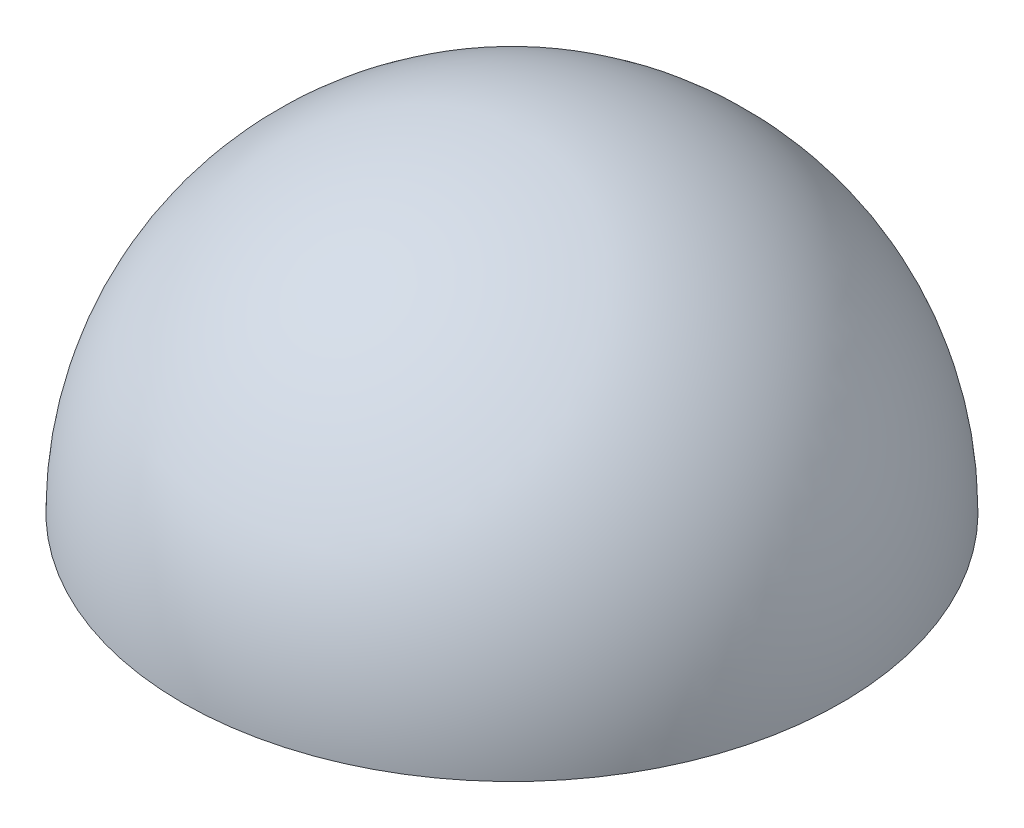
ISO-10303-21;
HEADER;
FILE_DESCRIPTION(('STEP AP214'),'2;1');
FILE_NAME('part.step','',(''),(''),'','','');
FILE_SCHEMA(('AUTOMOTIVE_DESIGN { 1 0 10303 214 1 1 1 1 }'));
ENDSEC;
DATA;
#1=APPLICATION_CONTEXT('core data for automotive mechanical design processes');
#2=APPLICATION_PROTOCOL_DEFINITION('international standard','automotive_design',2000,#1);
#3=PRODUCT_CONTEXT('',#1,'mechanical');
#4=PRODUCT('Part','Part','',(#3));
#5=PRODUCT_RELATED_PRODUCT_CATEGORY('part','',(#4));
#6=PRODUCT_DEFINITION_FORMATION('','',#4);
#7=PRODUCT_DEFINITION_CONTEXT('part definition',#1,'design');
#8=PRODUCT_DEFINITION('design','',#6,#7);
#9=PRODUCT_DEFINITION_SHAPE('','',#8);
#10=(LENGTH_UNIT() NAMED_UNIT(*) SI_UNIT(.MILLI.,.METRE.));
#11=(NAMED_UNIT(*) PLANE_ANGLE_UNIT() SI_UNIT($,.RADIAN.));
#12=(NAMED_UNIT(*) SI_UNIT($,.STERADIAN.) SOLID_ANGLE_UNIT());
#13=UNCERTAINTY_MEASURE_WITH_UNIT(LENGTH_MEASURE(1.E-05),#10,'distance_accuracy_value','');
#14=(GEOMETRIC_REPRESENTATION_CONTEXT(3) GLOBAL_UNCERTAINTY_ASSIGNED_CONTEXT((#13)) GLOBAL_UNIT_ASSIGNED_CONTEXT((#10,
#11,#12)) REPRESENTATION_CONTEXT('',''));
#15=CARTESIAN_POINT('',(0.,0.,0.));
#16=DIRECTION('',(0.,0.,1.));
#17=DIRECTION('',(1.,0.,0.));
#18=AXIS2_PLACEMENT_3D('',#15,#16,#17);
#19=CARTESIAN_POINT('',(3.2499999999994,76.7499999999998,0.249999999999985));
#20=DIRECTION('',(1.,0.,0.));
#21=DIRECTION('',(0.,0.,1.));
#22=AXIS2_PLACEMENT_3D('',#19,#20,#21);
#23=SPHERICAL_SURFACE('',#22,10.25);
#24=CARTESIAN_POINT('',(3.2499999999994,76.7499999999998,0.249999999999985));
#25=DIRECTION('',(0.,1.,0.));
#26=DIRECTION('',(0.,0.,1.));
#27=AXIS2_PLACEMENT_3D('',#24,#25,#26);
#28=SPHERICAL_SURFACE('',#27,10.25);
#29=CARTESIAN_POINT('',(3.2499999999994,76.7499999999998,0.249999999999985));
#30=DIRECTION('',(0.,1.,0.));
#31=DIRECTION('',(0.,0.,1.));
#32=AXIS2_PLACEMENT_3D('',#29,#30,#31);
#33=CIRCLE('',#32,10.25);
#34=CARTESIAN_POINT('',(3.2499999999994,76.7499999999999,10.5));
#35=VERTEX_POINT('',#34);
#36=EDGE_CURVE('E11',#35,#35,#33,.T.);
#37=ORIENTED_EDGE('',*,*,#36,.T.);
#38=EDGE_LOOP('',(#37));
#39=FACE_BOUND('',#38,.T.);
#40=ADVANCED_FACE('F35',(#39),#28,.T.);
#41=CARTESIAN_POINT('',(3.2499999999994,76.7499999999998,0.249999999999985));
#42=DIRECTION('',(0.,1.,0.));
#43=DIRECTION('',(0.,0.,1.));
#44=AXIS2_PLACEMENT_3D('',#41,#42,#43);
#45=PLANE('',#44);
#46=DIRECTION('',(-1.,0.,0.));
#47=VECTOR('',#46,1.);
#48=CARTESIAN_POINT('',(1.7499999999994,76.7499999999998,1.74999999999998));
#49=LINE('',#48,#47);
#50=CARTESIAN_POINT('',(4.7499999999994,76.7499999999998,1.74999999999998));
#51=VERTEX_POINT('',#50);
#52=CARTESIAN_POINT('',(1.7499999999994,76.7499999999998,1.74999999999998));
#53=VERTEX_POINT('',#52);
#54=EDGE_CURVE('E83',#51,#53,#49,.T.);
#55=ORIENTED_EDGE('',*,*,#54,.F.);
#56=DIRECTION('',(0.,0.,1.));
#57=VECTOR('',#56,1.);
#58=CARTESIAN_POINT('',(4.7499999999994,76.7499999999998,-1.25000000000002));
#59=LINE('',#58,#57);
#60=CARTESIAN_POINT('',(4.7499999999994,76.7499999999998,-1.25000000000002));
#61=VERTEX_POINT('',#60);
#62=EDGE_CURVE('E49',#61,#51,#59,.T.);
#63=ORIENTED_EDGE('',*,*,#62,.F.);
#64=DIRECTION('',(1.,0.,0.));
#65=VECTOR('',#64,1.);
#66=CARTESIAN_POINT('',(1.7499999999994,76.7499999999998,-1.25000000000002));
#67=LINE('',#66,#65);
#68=CARTESIAN_POINT('',(1.7499999999994,76.7499999999998,-1.25000000000002));
#69=VERTEX_POINT('',#68);
#70=EDGE_CURVE('E99',#69,#61,#67,.T.);
#71=ORIENTED_EDGE('',*,*,#70,.F.);
#72=DIRECTION('',(0.,0.,-1.));
#73=VECTOR('',#72,1.);
#74=CARTESIAN_POINT('',(1.7499999999994,76.7499999999998,-1.25000000000002));
#75=LINE('',#74,#73);
#76=EDGE_CURVE('E105',#53,#69,#75,.T.);
#77=ORIENTED_EDGE('',*,*,#76,.F.);
#78=EDGE_LOOP('',(#55,#63,#71,#77));
#79=FACE_BOUND('',#78,.T.);
#80=ORIENTED_EDGE('',*,*,#36,.F.);
#81=EDGE_LOOP('',(#80));
#82=FACE_BOUND('',#81,.T.);
#83=ADVANCED_FACE('F110',(#79,#82),#45,.F.);
#84=CARTESIAN_POINT('',(4.7499999999994,82.7499999999998,-1.25000000000006));
#85=DIRECTION('',(1.,0.,0.));
#86=DIRECTION('',(0.,0.,-1.));
#87=AXIS2_PLACEMENT_3D('',#84,#85,#86);
#88=PLANE('',#87);
#89=ORIENTED_EDGE('',*,*,#62,.T.);
#90=DIRECTION('',(0.,-1.,0.));
#91=VECTOR('',#90,1.);
#92=CARTESIAN_POINT('',(4.7499999999994,82.7499999999999,1.74999999999994));
#93=LINE('',#92,#91);
#94=CARTESIAN_POINT('',(4.7499999999994,82.7499999999999,1.74999999999994));
#95=VERTEX_POINT('',#94);
#96=EDGE_CURVE('E71',#95,#51,#93,.T.);
#97=ORIENTED_EDGE('',*,*,#96,.F.);
#98=DIRECTION('',(0.,0.,1.));
#99=VECTOR('',#98,1.);
#100=CARTESIAN_POINT('',(4.7499999999994,82.7499999999998,-1.25000000000006));
#101=LINE('',#100,#99);
#102=CARTESIAN_POINT('',(4.7499999999994,82.7499999999998,-1.25000000000006));
#103=VERTEX_POINT('',#102);
#104=EDGE_CURVE('E97',#103,#95,#101,.T.);
#105=ORIENTED_EDGE('',*,*,#104,.F.);
#106=DIRECTION('',(0.,-1.,0.));
#107=VECTOR('',#106,1.);
#108=CARTESIAN_POINT('',(4.7499999999994,82.7499999999998,-1.25000000000006));
#109=LINE('',#108,#107);
#110=EDGE_CURVE('E42',#103,#61,#109,.T.);
#111=ORIENTED_EDGE('',*,*,#110,.T.);
#112=EDGE_LOOP('',(#89,#97,#105,#111));
#113=FACE_BOUND('',#112,.T.);
#114=ADVANCED_FACE('F115',(#113),#88,.F.);
#115=CARTESIAN_POINT('',(1.7499999999994,82.7499999999998,-1.25000000000006));
#116=DIRECTION('',(0.,0.,-1.));
#117=DIRECTION('',(0.,1.,0.));
#118=AXIS2_PLACEMENT_3D('',#115,#116,#117);
#119=PLANE('',#118);
#120=ORIENTED_EDGE('',*,*,#70,.T.);
#121=ORIENTED_EDGE('',*,*,#110,.F.);
#122=DIRECTION('',(1.,0.,0.));
#123=VECTOR('',#122,1.);
#124=CARTESIAN_POINT('',(1.7499999999994,82.7499999999998,-1.25000000000006));
#125=LINE('',#124,#123);
#126=CARTESIAN_POINT('',(1.7499999999994,82.7499999999998,-1.25000000000006));
#127=VERTEX_POINT('',#126);
#128=EDGE_CURVE('E94',#127,#103,#125,.T.);
#129=ORIENTED_EDGE('',*,*,#128,.F.);
#130=DIRECTION('',(0.,-1.,0.));
#131=VECTOR('',#130,1.);
#132=CARTESIAN_POINT('',(1.7499999999994,82.7499999999998,-1.25000000000006));
#133=LINE('',#132,#131);
#134=EDGE_CURVE('E87',#127,#69,#133,.T.);
#135=ORIENTED_EDGE('',*,*,#134,.T.);
#136=EDGE_LOOP('',(#120,#121,#129,#135));
#137=FACE_BOUND('',#136,.T.);
#138=ADVANCED_FACE('F113',(#137),#119,.F.);
#139=CARTESIAN_POINT('',(1.7499999999994,82.7499999999998,-1.25000000000006));
#140=DIRECTION('',(-1.,0.,0.));
#141=DIRECTION('',(0.,0.,1.));
#142=AXIS2_PLACEMENT_3D('',#139,#140,#141);
#143=PLANE('',#142);
#144=ORIENTED_EDGE('',*,*,#76,.T.);
#145=ORIENTED_EDGE('',*,*,#134,.F.);
#146=DIRECTION('',(0.,0.,-1.));
#147=VECTOR('',#146,1.);
#148=CARTESIAN_POINT('',(1.7499999999994,82.7499999999998,-1.25000000000006));
#149=LINE('',#148,#147);
#150=CARTESIAN_POINT('',(1.7499999999994,82.7499999999999,1.74999999999994));
#151=VERTEX_POINT('',#150);
#152=EDGE_CURVE('E90',#151,#127,#149,.T.);
#153=ORIENTED_EDGE('',*,*,#152,.F.);
#154=DIRECTION('',(0.,-1.,0.));
#155=VECTOR('',#154,1.);
#156=CARTESIAN_POINT('',(1.7499999999994,82.7499999999999,1.74999999999994));
#157=LINE('',#156,#155);
#158=EDGE_CURVE('E76',#151,#53,#157,.T.);
#159=ORIENTED_EDGE('',*,*,#158,.T.);
#160=EDGE_LOOP('',(#144,#145,#153,#159));
#161=FACE_BOUND('',#160,.T.);
#162=ADVANCED_FACE('F91',(#161),#143,.F.);
#163=CARTESIAN_POINT('',(1.7499999999994,82.7499999999999,1.74999999999994));
#164=DIRECTION('',(0.,0.,1.));
#165=DIRECTION('',(0.,-1.,0.));
#166=AXIS2_PLACEMENT_3D('',#163,#164,#165);
#167=PLANE('',#166);
#168=ORIENTED_EDGE('',*,*,#54,.T.);
#169=ORIENTED_EDGE('',*,*,#158,.F.);
#170=DIRECTION('',(-1.,0.,0.));
#171=VECTOR('',#170,1.);
#172=CARTESIAN_POINT('',(1.7499999999994,82.7499999999999,1.74999999999994));
#173=LINE('',#172,#171);
#174=EDGE_CURVE('E80',#95,#151,#173,.T.);
#175=ORIENTED_EDGE('',*,*,#174,.F.);
#176=ORIENTED_EDGE('',*,*,#96,.T.);
#177=EDGE_LOOP('',(#168,#169,#175,#176));
#178=FACE_BOUND('',#177,.T.);
#179=ADVANCED_FACE('F78',(#178),#167,.F.);
#180=CARTESIAN_POINT('',(0.,82.7499999999998,-7.51977918899289E-13));
#181=DIRECTION('',(0.,1.,0.));
#182=DIRECTION('',(0.,0.,1.));
#183=AXIS2_PLACEMENT_3D('',#180,#181,#182);
#184=PLANE('',#183);
#185=ORIENTED_EDGE('',*,*,#104,.T.);
#186=ORIENTED_EDGE('',*,*,#174,.T.);
#187=ORIENTED_EDGE('',*,*,#152,.T.);
#188=ORIENTED_EDGE('',*,*,#128,.T.);
#189=EDGE_LOOP('',(#185,#186,#187,#188));
#190=FACE_BOUND('',#189,.T.);
#191=ADVANCED_FACE('F96',(#190),#184,.F.);
#192=CLOSED_SHELL('',(#40,#83,#114,#138,#162,#179,#191));
#193=MANIFOLD_SOLID_BREP('B2',#192);
#194=ADVANCED_BREP_SHAPE_REPRESENTATION('',(#18,#193),#14);
#195=SHAPE_DEFINITION_REPRESENTATION(#9,#194);
ENDSEC;
END-ISO-10303-21;
